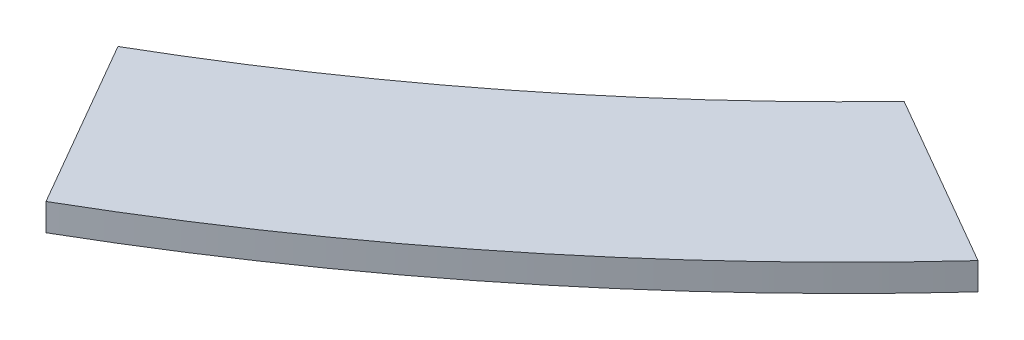
ISO-10303-21;
HEADER;
FILE_DESCRIPTION(('STEP AP214'),'2;1');
FILE_NAME('part.step','',(''),(''),'','','');
FILE_SCHEMA(('AUTOMOTIVE_DESIGN { 1 0 10303 214 1 1 1 1 }'));
ENDSEC;
DATA;
#1=APPLICATION_CONTEXT('core data for automotive mechanical design processes');
#2=APPLICATION_PROTOCOL_DEFINITION('international standard','automotive_design',2000,#1);
#3=PRODUCT_CONTEXT('',#1,'mechanical');
#4=PRODUCT('Part','Part','',(#3));
#5=PRODUCT_RELATED_PRODUCT_CATEGORY('part','',(#4));
#6=PRODUCT_DEFINITION_FORMATION('','',#4);
#7=PRODUCT_DEFINITION_CONTEXT('part definition',#1,'design');
#8=PRODUCT_DEFINITION('design','',#6,#7);
#9=PRODUCT_DEFINITION_SHAPE('','',#8);
#10=(LENGTH_UNIT() NAMED_UNIT(*) SI_UNIT(.MILLI.,.METRE.));
#11=(NAMED_UNIT(*) PLANE_ANGLE_UNIT() SI_UNIT($,.RADIAN.));
#12=(NAMED_UNIT(*) SI_UNIT($,.STERADIAN.) SOLID_ANGLE_UNIT());
#13=UNCERTAINTY_MEASURE_WITH_UNIT(LENGTH_MEASURE(1.E-05),#10,'distance_accuracy_value','');
#14=(GEOMETRIC_REPRESENTATION_CONTEXT(3) GLOBAL_UNCERTAINTY_ASSIGNED_CONTEXT((#13)) GLOBAL_UNIT_ASSIGNED_CONTEXT((#10,
#11,#12)) REPRESENTATION_CONTEXT('',''));
#15=CARTESIAN_POINT('',(0.,0.,0.));
#16=DIRECTION('',(0.,0.,1.));
#17=DIRECTION('',(1.,0.,0.));
#18=AXIS2_PLACEMENT_3D('',#15,#16,#17);
#19=CARTESIAN_POINT('',(0.,0.762,0.));
#20=DIRECTION('',(0.866025403784474,0.,-0.499999999999939));
#21=DIRECTION('',(-0.499999999999939,0.,-0.866025403784474));
#22=AXIS2_PLACEMENT_3D('',#19,#20,#21);
#23=PLANE('',#22);
#24=DIRECTION('',(0.499999999999939,0.,0.866025403784474));
#25=VECTOR('',#24,1.);
#26=CARTESIAN_POINT('',(0.,0.,0.));
#27=LINE('',#26,#25);
#28=CARTESIAN_POINT('',(27.9399999999966,0.,48.3934995634764));
#29=VERTEX_POINT('',#28);
#30=CARTESIAN_POINT('',(30.7022499999963,0.,53.1778569066837));
#31=VERTEX_POINT('',#30);
#32=EDGE_CURVE('E107',#29,#31,#27,.T.);
#33=ORIENTED_EDGE('',*,*,#32,.T.);
#34=DIRECTION('',(0.,-1.,0.));
#35=VECTOR('',#34,1.);
#36=CARTESIAN_POINT('',(30.7022499999963,0.762,53.1778569066837));
#37=LINE('',#36,#35);
#38=CARTESIAN_POINT('',(30.7022499999963,0.762,53.1778569066837));
#39=VERTEX_POINT('',#38);
#40=EDGE_CURVE('E11',#39,#31,#37,.T.);
#41=ORIENTED_EDGE('',*,*,#40,.F.);
#42=DIRECTION('',(0.499999999999939,0.,0.866025403784474));
#43=VECTOR('',#42,1.);
#44=CARTESIAN_POINT('',(0.,0.762,0.));
#45=LINE('',#44,#43);
#46=CARTESIAN_POINT('',(27.9399999999966,0.762,48.3934995634764));
#47=VERTEX_POINT('',#46);
#48=EDGE_CURVE('E93',#47,#39,#45,.T.);
#49=ORIENTED_EDGE('',*,*,#48,.F.);
#50=DIRECTION('',(0.,-1.,0.));
#51=VECTOR('',#50,1.);
#52=CARTESIAN_POINT('',(27.9399999999966,0.762,48.3934995634764));
#53=LINE('',#52,#51);
#54=EDGE_CURVE('E60',#47,#29,#53,.T.);
#55=ORIENTED_EDGE('',*,*,#54,.T.);
#56=EDGE_LOOP('',(#33,#41,#49,#55));
#57=FACE_BOUND('',#56,.T.);
#58=ADVANCED_FACE('F44',(#57),#23,.F.);
#59=CARTESIAN_POINT('',(0.,0.762,0.));
#60=DIRECTION('',(0.,-1.,0.));
#61=DIRECTION('',(0.,0.,-1.));
#62=AXIS2_PLACEMENT_3D('',#59,#60,#61);
#63=CYLINDRICAL_SURFACE('',#62,61.4045);
#64=CARTESIAN_POINT('',(0.,0.,0.));
#65=DIRECTION('',(0.,1.,0.));
#66=DIRECTION('',(0.,0.,1.));
#67=AXIS2_PLACEMENT_3D('',#64,#65,#66);
#68=CIRCLE('',#67,61.4045);
#69=CARTESIAN_POINT('',(45.2412448936835,0.,41.5179765971291));
#70=VERTEX_POINT('',#69);
#71=EDGE_CURVE('E98',#31,#70,#68,.T.);
#72=ORIENTED_EDGE('',*,*,#71,.T.);
#73=DIRECTION('',(0.,-1.,0.));
#74=VECTOR('',#73,1.);
#75=CARTESIAN_POINT('',(45.2412448936835,0.762,41.5179765971291));
#76=LINE('',#75,#74);
#77=CARTESIAN_POINT('',(45.2412448936835,0.762,41.5179765971291));
#78=VERTEX_POINT('',#77);
#79=EDGE_CURVE('E52',#78,#70,#76,.T.);
#80=ORIENTED_EDGE('',*,*,#79,.F.);
#81=CARTESIAN_POINT('',(0.,0.762,0.));
#82=DIRECTION('',(0.,1.,0.));
#83=DIRECTION('',(0.,0.,1.));
#84=AXIS2_PLACEMENT_3D('',#81,#82,#83);
#85=CIRCLE('',#84,61.4045);
#86=EDGE_CURVE('E85',#39,#78,#85,.T.);
#87=ORIENTED_EDGE('',*,*,#86,.F.);
#88=ORIENTED_EDGE('',*,*,#40,.T.);
#89=EDGE_LOOP('',(#72,#80,#87,#88));
#90=FACE_BOUND('',#89,.T.);
#91=ADVANCED_FACE('F97',(#90),#63,.T.);
#92=CARTESIAN_POINT('',(-6.66749999999999,0.762,11.5484487594656));
#93=DIRECTION('',(0.499999999999997,0.,-0.866025403784441));
#94=DIRECTION('',(-0.866025403784441,0.,-0.499999999999997));
#95=AXIS2_PLACEMENT_3D('',#92,#93,#94);
#96=PLANE('',#95);
#97=DIRECTION('',(0.866025403784441,0.,0.499999999999997));
#98=VECTOR('',#97,1.);
#99=CARTESIAN_POINT('',(-6.66749999999999,0.,11.5484487594656));
#100=LINE('',#99,#98);
#101=CARTESIAN_POINT('',(40.3278628696493,0.,38.6812341629215));
#102=VERTEX_POINT('',#101);
#103=EDGE_CURVE('E110',#102,#70,#100,.T.);
#104=ORIENTED_EDGE('',*,*,#103,.F.);
#105=DIRECTION('',(0.,-1.,0.));
#106=VECTOR('',#105,1.);
#107=CARTESIAN_POINT('',(40.3278628696493,0.762,38.6812341629215));
#108=LINE('',#107,#106);
#109=CARTESIAN_POINT('',(40.3278628696493,0.762,38.6812341629215));
#110=VERTEX_POINT('',#109);
#111=EDGE_CURVE('E74',#110,#102,#108,.T.);
#112=ORIENTED_EDGE('',*,*,#111,.F.);
#113=DIRECTION('',(0.866025403784441,0.,0.499999999999997));
#114=VECTOR('',#113,1.);
#115=CARTESIAN_POINT('',(-6.66749999999999,0.762,11.5484487594656));
#116=LINE('',#115,#114);
#117=EDGE_CURVE('E92',#110,#78,#116,.T.);
#118=ORIENTED_EDGE('',*,*,#117,.T.);
#119=ORIENTED_EDGE('',*,*,#79,.T.);
#120=EDGE_LOOP('',(#104,#112,#118,#119));
#121=FACE_BOUND('',#120,.T.);
#122=ADVANCED_FACE('F101',(#121),#96,.T.);
#123=CARTESIAN_POINT('',(0.,0.762,0.));
#124=DIRECTION('',(0.,-1.,0.));
#125=DIRECTION('',(0.,0.,-1.));
#126=AXIS2_PLACEMENT_3D('',#123,#124,#125);
#127=CYLINDRICAL_SURFACE('',#126,55.88);
#128=CARTESIAN_POINT('',(0.,0.,0.));
#129=DIRECTION('',(0.,1.,0.));
#130=DIRECTION('',(0.,0.,1.));
#131=AXIS2_PLACEMENT_3D('',#128,#129,#130);
#132=CIRCLE('',#131,55.88);
#133=EDGE_CURVE('E112',#29,#102,#132,.T.);
#134=ORIENTED_EDGE('',*,*,#133,.F.);
#135=ORIENTED_EDGE('',*,*,#54,.F.);
#136=CARTESIAN_POINT('',(0.,0.762,0.));
#137=DIRECTION('',(0.,1.,0.));
#138=DIRECTION('',(0.,0.,1.));
#139=AXIS2_PLACEMENT_3D('',#136,#137,#138);
#140=CIRCLE('',#139,55.88);
#141=EDGE_CURVE('E102',#47,#110,#140,.T.);
#142=ORIENTED_EDGE('',*,*,#141,.T.);
#143=ORIENTED_EDGE('',*,*,#111,.T.);
#144=EDGE_LOOP('',(#134,#135,#142,#143));
#145=FACE_BOUND('',#144,.T.);
#146=ADVANCED_FACE('F118',(#145),#127,.F.);
#147=CARTESIAN_POINT('',(0.,0.762,0.));
#148=DIRECTION('',(0.,1.,0.));
#149=DIRECTION('',(0.,0.,1.));
#150=AXIS2_PLACEMENT_3D('',#147,#148,#149);
#151=PLANE('',#150);
#152=ORIENTED_EDGE('',*,*,#48,.T.);
#153=ORIENTED_EDGE('',*,*,#86,.T.);
#154=ORIENTED_EDGE('',*,*,#117,.F.);
#155=ORIENTED_EDGE('',*,*,#141,.F.);
#156=EDGE_LOOP('',(#152,#153,#154,#155));
#157=FACE_BOUND('',#156,.T.);
#158=ADVANCED_FACE('F89',(#157),#151,.T.);
#159=CARTESIAN_POINT('',(0.,0.,0.));
#160=DIRECTION('',(0.,1.,0.));
#161=DIRECTION('',(0.,0.,1.));
#162=AXIS2_PLACEMENT_3D('',#159,#160,#161);
#163=PLANE('',#162);
#164=ORIENTED_EDGE('',*,*,#32,.F.);
#165=ORIENTED_EDGE('',*,*,#133,.T.);
#166=ORIENTED_EDGE('',*,*,#103,.T.);
#167=ORIENTED_EDGE('',*,*,#71,.F.);
#168=EDGE_LOOP('',(#164,#165,#166,#167));
#169=FACE_BOUND('',#168,.T.);
#170=ADVANCED_FACE('F117',(#169),#163,.F.);
#171=CLOSED_SHELL('',(#58,#91,#122,#146,#158,#170));
#172=MANIFOLD_SOLID_BREP('B2',#171);
#173=ADVANCED_BREP_SHAPE_REPRESENTATION('',(#18,#172),#14);
#174=SHAPE_DEFINITION_REPRESENTATION(#9,#173);
ENDSEC;
END-ISO-10303-21;
